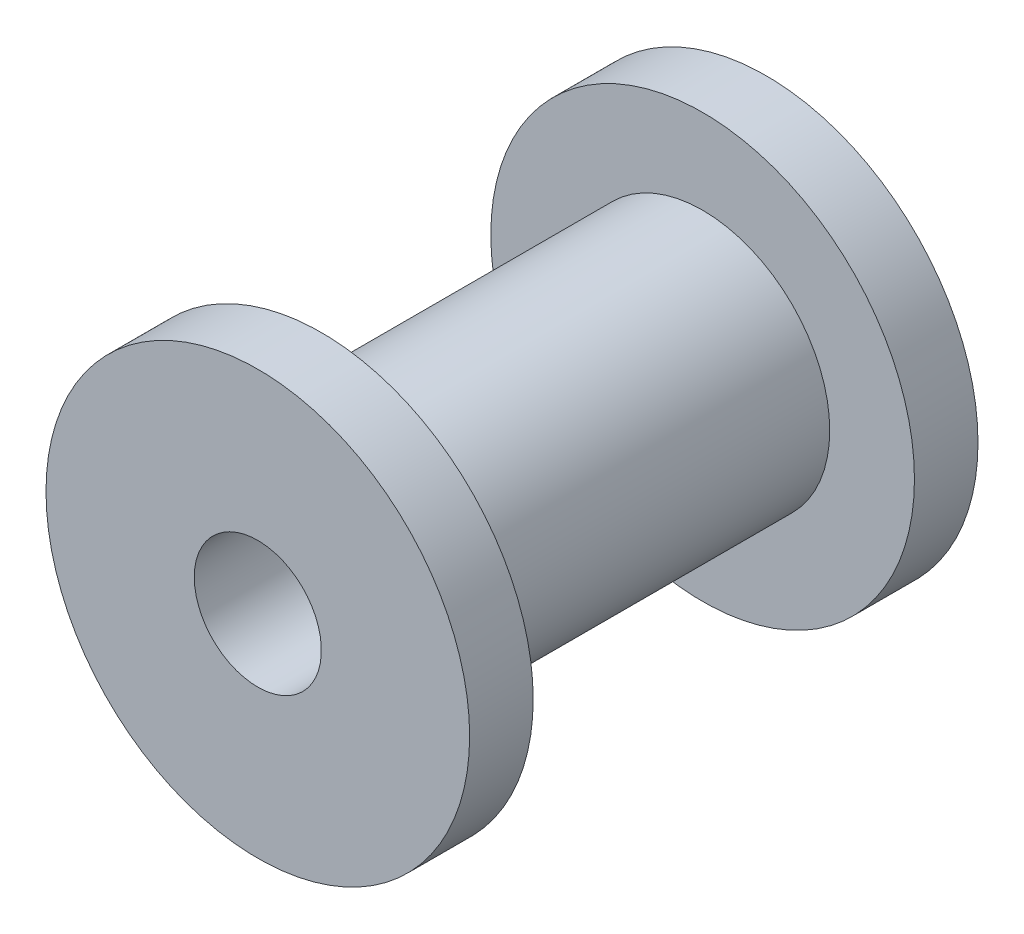
ISO-10303-21;
HEADER;
FILE_DESCRIPTION(('STEP AP214'),'2;1');
FILE_NAME('part.step','',(''),(''),'','','');
FILE_SCHEMA(('AUTOMOTIVE_DESIGN { 1 0 10303 214 1 1 1 1 }'));
ENDSEC;
DATA;
#1=APPLICATION_CONTEXT('core data for automotive mechanical design processes');
#2=APPLICATION_PROTOCOL_DEFINITION('international standard','automotive_design',2000,#1);
#3=PRODUCT_CONTEXT('',#1,'mechanical');
#4=PRODUCT('Part','Part','',(#3));
#5=PRODUCT_RELATED_PRODUCT_CATEGORY('part','',(#4));
#6=PRODUCT_DEFINITION_FORMATION('','',#4);
#7=PRODUCT_DEFINITION_CONTEXT('part definition',#1,'design');
#8=PRODUCT_DEFINITION('design','',#6,#7);
#9=PRODUCT_DEFINITION_SHAPE('','',#8);
#10=(LENGTH_UNIT() NAMED_UNIT(*) SI_UNIT(.MILLI.,.METRE.));
#11=(NAMED_UNIT(*) PLANE_ANGLE_UNIT() SI_UNIT($,.RADIAN.));
#12=(NAMED_UNIT(*) SI_UNIT($,.STERADIAN.) SOLID_ANGLE_UNIT());
#13=UNCERTAINTY_MEASURE_WITH_UNIT(LENGTH_MEASURE(1.E-05),#10,'distance_accuracy_value','');
#14=(GEOMETRIC_REPRESENTATION_CONTEXT(3) GLOBAL_UNCERTAINTY_ASSIGNED_CONTEXT((#13)) GLOBAL_UNIT_ASSIGNED_CONTEXT((#10,
#11,#12)) REPRESENTATION_CONTEXT('',''));
#15=CARTESIAN_POINT('',(0.,0.,0.));
#16=DIRECTION('',(0.,0.,1.));
#17=DIRECTION('',(1.,0.,0.));
#18=AXIS2_PLACEMENT_3D('',#15,#16,#17);
#19=CARTESIAN_POINT('',(0.,0.,-4.5));
#20=DIRECTION('',(0.,0.,1.));
#21=DIRECTION('',(1.,0.,0.));
#22=AXIS2_PLACEMENT_3D('',#19,#20,#21);
#23=CYLINDRICAL_SURFACE('',#22,3.);
#24=CARTESIAN_POINT('',(0.,0.,-4.5));
#25=DIRECTION('',(0.,0.,-1.));
#26=DIRECTION('',(-1.,0.,0.));
#27=AXIS2_PLACEMENT_3D('',#24,#25,#26);
#28=CIRCLE('',#27,3.);
#29=CARTESIAN_POINT('',(-3.,0.,-4.5));
#30=VERTEX_POINT('',#29);
#31=EDGE_CURVE('E46',#30,#30,#28,.F.);
#32=ORIENTED_EDGE('',*,*,#31,.T.);
#33=EDGE_LOOP('',(#32));
#34=FACE_BOUND('',#33,.T.);
#35=CARTESIAN_POINT('',(0.,0.,4.5));
#36=DIRECTION('',(0.,0.,1.));
#37=DIRECTION('',(1.,0.,0.));
#38=AXIS2_PLACEMENT_3D('',#35,#36,#37);
#39=CIRCLE('',#38,3.);
#40=CARTESIAN_POINT('',(3.,0.,4.5));
#41=VERTEX_POINT('',#40);
#42=EDGE_CURVE('E10',#41,#41,#39,.T.);
#43=ORIENTED_EDGE('',*,*,#42,.F.);
#44=EDGE_LOOP('',(#43));
#45=FACE_BOUND('',#44,.T.);
#46=ADVANCED_FACE('F31',(#34,#45),#23,.T.);
#47=CARTESIAN_POINT('',(0.,0.,6.));
#48=DIRECTION('',(0.,0.,-1.));
#49=DIRECTION('',(-1.,0.,0.));
#50=AXIS2_PLACEMENT_3D('',#47,#48,#49);
#51=CYLINDRICAL_SURFACE('',#50,5.);
#52=CARTESIAN_POINT('',(0.,0.,6.));
#53=DIRECTION('',(0.,0.,1.));
#54=DIRECTION('',(1.,0.,0.));
#55=AXIS2_PLACEMENT_3D('',#52,#53,#54);
#56=CIRCLE('',#55,5.);
#57=CARTESIAN_POINT('',(5.,0.,6.));
#58=VERTEX_POINT('',#57);
#59=EDGE_CURVE('E37',#58,#58,#56,.T.);
#60=ORIENTED_EDGE('',*,*,#59,.F.);
#61=EDGE_LOOP('',(#60));
#62=FACE_BOUND('',#61,.T.);
#63=CARTESIAN_POINT('',(0.,0.,4.5));
#64=DIRECTION('',(0.,0.,1.));
#65=DIRECTION('',(1.,0.,0.));
#66=AXIS2_PLACEMENT_3D('',#63,#64,#65);
#67=CIRCLE('',#66,5.);
#68=CARTESIAN_POINT('',(5.,0.,4.5));
#69=VERTEX_POINT('',#68);
#70=EDGE_CURVE('E41',#69,#69,#67,.T.);
#71=ORIENTED_EDGE('',*,*,#70,.T.);
#72=EDGE_LOOP('',(#71));
#73=FACE_BOUND('',#72,.T.);
#74=ADVANCED_FACE('F92',(#62,#73),#51,.T.);
#75=CARTESIAN_POINT('',(0.,0.,6.));
#76=DIRECTION('',(0.,0.,1.));
#77=DIRECTION('',(1.,0.,0.));
#78=AXIS2_PLACEMENT_3D('',#75,#76,#77);
#79=PLANE('',#78);
#80=CARTESIAN_POINT('',(0.,0.,6.));
#81=DIRECTION('',(0.,0.,-1.));
#82=DIRECTION('',(-1.,0.,0.));
#83=AXIS2_PLACEMENT_3D('',#80,#81,#82);
#84=CIRCLE('',#83,1.5);
#85=CARTESIAN_POINT('',(-1.5,0.,6.));
#86=VERTEX_POINT('',#85);
#87=EDGE_CURVE('E54',#86,#86,#84,.T.);
#88=ORIENTED_EDGE('',*,*,#87,.T.);
#89=EDGE_LOOP('',(#88));
#90=FACE_BOUND('',#89,.T.);
#91=ORIENTED_EDGE('',*,*,#59,.T.);
#92=EDGE_LOOP('',(#91));
#93=FACE_BOUND('',#92,.T.);
#94=ADVANCED_FACE('F63',(#90,#93),#79,.T.);
#95=CARTESIAN_POINT('',(0.,0.,4.5));
#96=DIRECTION('',(0.,0.,1.));
#97=DIRECTION('',(1.,0.,0.));
#98=AXIS2_PLACEMENT_3D('',#95,#96,#97);
#99=PLANE('',#98);
#100=ORIENTED_EDGE('',*,*,#42,.T.);
#101=EDGE_LOOP('',(#100));
#102=FACE_BOUND('',#101,.T.);
#103=ORIENTED_EDGE('',*,*,#70,.F.);
#104=EDGE_LOOP('',(#103));
#105=FACE_BOUND('',#104,.T.);
#106=ADVANCED_FACE('F81',(#102,#105),#99,.F.);
#107=CARTESIAN_POINT('',(0.,0.,-6.));
#108=DIRECTION('',(0.,0.,1.));
#109=DIRECTION('',(1.,0.,0.));
#110=AXIS2_PLACEMENT_3D('',#107,#108,#109);
#111=CYLINDRICAL_SURFACE('',#110,5.);
#112=CARTESIAN_POINT('',(0.,0.,-6.));
#113=DIRECTION('',(0.,0.,-1.));
#114=DIRECTION('',(-1.,0.,0.));
#115=AXIS2_PLACEMENT_3D('',#112,#113,#114);
#116=CIRCLE('',#115,5.);
#117=CARTESIAN_POINT('',(-5.,0.,-6.));
#118=VERTEX_POINT('',#117);
#119=EDGE_CURVE('E50',#118,#118,#116,.T.);
#120=ORIENTED_EDGE('',*,*,#119,.F.);
#121=EDGE_LOOP('',(#120));
#122=FACE_BOUND('',#121,.T.);
#123=CARTESIAN_POINT('',(0.,0.,-4.5));
#124=DIRECTION('',(0.,0.,-1.));
#125=DIRECTION('',(-1.,0.,0.));
#126=AXIS2_PLACEMENT_3D('',#123,#124,#125);
#127=CIRCLE('',#126,5.);
#128=CARTESIAN_POINT('',(-5.,0.,-4.5));
#129=VERTEX_POINT('',#128);
#130=EDGE_CURVE('E51',#129,#129,#127,.T.);
#131=ORIENTED_EDGE('',*,*,#130,.T.);
#132=EDGE_LOOP('',(#131));
#133=FACE_BOUND('',#132,.T.);
#134=ADVANCED_FACE('F75',(#122,#133),#111,.T.);
#135=CARTESIAN_POINT('',(0.,0.,-6.));
#136=DIRECTION('',(0.,0.,-1.));
#137=DIRECTION('',(-1.,0.,0.));
#138=AXIS2_PLACEMENT_3D('',#135,#136,#137);
#139=PLANE('',#138);
#140=CARTESIAN_POINT('',(0.,0.,-6.));
#141=DIRECTION('',(0.,0.,-1.));
#142=DIRECTION('',(-1.,0.,0.));
#143=AXIS2_PLACEMENT_3D('',#140,#141,#142);
#144=CIRCLE('',#143,1.5);
#145=CARTESIAN_POINT('',(-1.5,0.,-6.));
#146=VERTEX_POINT('',#145);
#147=EDGE_CURVE('E57',#146,#146,#144,.T.);
#148=ORIENTED_EDGE('',*,*,#147,.F.);
#149=EDGE_LOOP('',(#148));
#150=FACE_BOUND('',#149,.T.);
#151=ORIENTED_EDGE('',*,*,#119,.T.);
#152=EDGE_LOOP('',(#151));
#153=FACE_BOUND('',#152,.T.);
#154=ADVANCED_FACE('F72',(#150,#153),#139,.T.);
#155=CARTESIAN_POINT('',(0.,0.,-4.5));
#156=DIRECTION('',(0.,0.,-1.));
#157=DIRECTION('',(-1.,0.,0.));
#158=AXIS2_PLACEMENT_3D('',#155,#156,#157);
#159=PLANE('',#158);
#160=ORIENTED_EDGE('',*,*,#31,.F.);
#161=EDGE_LOOP('',(#160));
#162=FACE_BOUND('',#161,.T.);
#163=ORIENTED_EDGE('',*,*,#130,.F.);
#164=EDGE_LOOP('',(#163));
#165=FACE_BOUND('',#164,.T.);
#166=ADVANCED_FACE('F68',(#162,#165),#159,.F.);
#167=CARTESIAN_POINT('',(0.,0.,6.));
#168=DIRECTION('',(0.,0.,-1.));
#169=DIRECTION('',(-1.,0.,0.));
#170=AXIS2_PLACEMENT_3D('',#167,#168,#169);
#171=CYLINDRICAL_SURFACE('',#170,1.5);
#172=ORIENTED_EDGE('',*,*,#87,.F.);
#173=EDGE_LOOP('',(#172));
#174=FACE_BOUND('',#173,.T.);
#175=ORIENTED_EDGE('',*,*,#147,.T.);
#176=EDGE_LOOP('',(#175));
#177=FACE_BOUND('',#176,.T.);
#178=ADVANCED_FACE('F65',(#174,#177),#171,.F.);
#179=CLOSED_SHELL('',(#46,#74,#94,#106,#134,#154,#166,#178));
#180=MANIFOLD_SOLID_BREP('B2',#179);
#181=ADVANCED_BREP_SHAPE_REPRESENTATION('',(#18,#180),#14);
#182=SHAPE_DEFINITION_REPRESENTATION(#9,#181);
ENDSEC;
END-ISO-10303-21;
